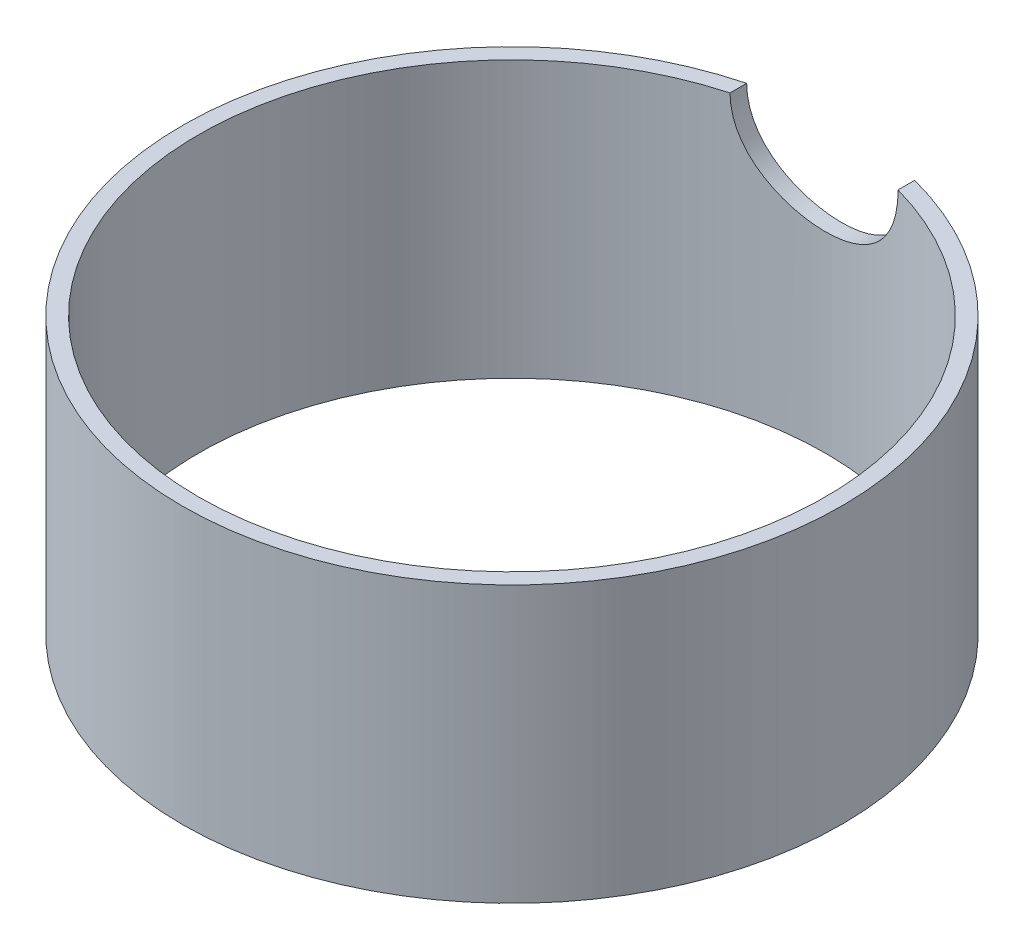
ISO-10303-21;
HEADER;
FILE_DESCRIPTION(('STEP AP214'),'2;1');
FILE_NAME('part.step','',(''),(''),'','','');
FILE_SCHEMA(('AUTOMOTIVE_DESIGN { 1 0 10303 214 1 1 1 1 }'));
ENDSEC;
DATA;
#1=APPLICATION_CONTEXT('core data for automotive mechanical design processes');
#2=APPLICATION_PROTOCOL_DEFINITION('international standard','automotive_design',2000,#1);
#3=PRODUCT_CONTEXT('',#1,'mechanical');
#4=PRODUCT('Part','Part','',(#3));
#5=PRODUCT_RELATED_PRODUCT_CATEGORY('part','',(#4));
#6=PRODUCT_DEFINITION_FORMATION('','',#4);
#7=PRODUCT_DEFINITION_CONTEXT('part definition',#1,'design');
#8=PRODUCT_DEFINITION('design','',#6,#7);
#9=PRODUCT_DEFINITION_SHAPE('','',#8);
#10=(LENGTH_UNIT() NAMED_UNIT(*) SI_UNIT(.MILLI.,.METRE.));
#11=(NAMED_UNIT(*) PLANE_ANGLE_UNIT() SI_UNIT($,.RADIAN.));
#12=(NAMED_UNIT(*) SI_UNIT($,.STERADIAN.) SOLID_ANGLE_UNIT());
#13=UNCERTAINTY_MEASURE_WITH_UNIT(LENGTH_MEASURE(1.E-05),#10,'distance_accuracy_value','');
#14=(GEOMETRIC_REPRESENTATION_CONTEXT(3) GLOBAL_UNCERTAINTY_ASSIGNED_CONTEXT((#13)) GLOBAL_UNIT_ASSIGNED_CONTEXT((#10,
#11,#12)) REPRESENTATION_CONTEXT('',''));
#15=CARTESIAN_POINT('',(0.,0.,0.));
#16=DIRECTION('',(0.,0.,1.));
#17=DIRECTION('',(1.,0.,0.));
#18=AXIS2_PLACEMENT_3D('',#15,#16,#17);
#19=CARTESIAN_POINT('',(0.,34.3,0.));
#20=DIRECTION('',(0.,1.,0.));
#21=DIRECTION('',(0.,0.,1.));
#22=AXIS2_PLACEMENT_3D('',#19,#20,#21);
#23=PLANE('',#22);
#24=DIRECTION('',(0.,0.,1.));
#25=VECTOR('',#24,1.);
#26=CARTESIAN_POINT('',(-10.45,34.3,-41.));
#27=LINE('',#26,#25);
#28=CARTESIAN_POINT('',(-10.45,34.3,-39.645901427512));
#29=VERTEX_POINT('',#28);
#30=CARTESIAN_POINT('',(-10.45,34.3,-37.5738938626275));
#31=VERTEX_POINT('',#30);
#32=EDGE_CURVE('E54',#29,#31,#27,.T.);
#33=ORIENTED_EDGE('',*,*,#32,.F.);
#34=CARTESIAN_POINT('',(0.,34.3,0.));
#35=DIRECTION('',(0.,1.,0.));
#36=DIRECTION('',(0.,0.,1.));
#37=AXIS2_PLACEMENT_3D('',#34,#35,#36);
#38=CIRCLE('',#37,41.);
#39=CARTESIAN_POINT('',(10.45,34.3,-39.645901427512));
#40=VERTEX_POINT('',#39);
#41=EDGE_CURVE('E48',#29,#40,#38,.T.);
#42=ORIENTED_EDGE('',*,*,#41,.T.);
#43=DIRECTION('',(0.,0.,1.));
#44=VECTOR('',#43,1.);
#45=CARTESIAN_POINT('',(10.45,34.3,-41.));
#46=LINE('',#45,#44);
#47=CARTESIAN_POINT('',(10.45,34.3,-37.5738938626275));
#48=VERTEX_POINT('',#47);
#49=EDGE_CURVE('E65',#48,#40,#46,.F.);
#50=ORIENTED_EDGE('',*,*,#49,.F.);
#51=CARTESIAN_POINT('',(0.,34.3,0.));
#52=DIRECTION('',(0.,1.,0.));
#53=DIRECTION('',(0.,0.,1.));
#54=AXIS2_PLACEMENT_3D('',#51,#52,#53);
#55=CIRCLE('',#54,39.);
#56=EDGE_CURVE('E71',#31,#48,#55,.T.);
#57=ORIENTED_EDGE('',*,*,#56,.F.);
#58=EDGE_LOOP('',(#33,#42,#50,#57));
#59=FACE_BOUND('',#58,.T.);
#60=ADVANCED_FACE('F33',(#59),#23,.T.);
#61=CARTESIAN_POINT('',(0.,0.,0.));
#62=DIRECTION('',(0.,1.,0.));
#63=DIRECTION('',(0.,0.,1.));
#64=AXIS2_PLACEMENT_3D('',#61,#62,#63);
#65=PLANE('',#64);
#66=CARTESIAN_POINT('',(0.,0.,0.));
#67=DIRECTION('',(0.,1.,0.));
#68=DIRECTION('',(0.,0.,1.));
#69=AXIS2_PLACEMENT_3D('',#66,#67,#68);
#70=CIRCLE('',#69,41.);
#71=CARTESIAN_POINT('',(0.,0.,41.));
#72=VERTEX_POINT('',#71);
#73=EDGE_CURVE('E76',#72,#72,#70,.T.);
#74=ORIENTED_EDGE('',*,*,#73,.F.);
#75=EDGE_LOOP('',(#74));
#76=FACE_BOUND('',#75,.T.);
#77=CARTESIAN_POINT('',(0.,0.,0.));
#78=DIRECTION('',(0.,1.,0.));
#79=DIRECTION('',(0.,0.,1.));
#80=AXIS2_PLACEMENT_3D('',#77,#78,#79);
#81=CIRCLE('',#80,39.);
#82=CARTESIAN_POINT('',(0.,0.,39.));
#83=VERTEX_POINT('',#82);
#84=EDGE_CURVE('E77',#83,#83,#81,.T.);
#85=ORIENTED_EDGE('',*,*,#84,.T.);
#86=EDGE_LOOP('',(#85));
#87=FACE_BOUND('',#86,.T.);
#88=ADVANCED_FACE('F96',(#76,#87),#65,.F.);
#89=CARTESIAN_POINT('',(0.,34.3,0.));
#90=DIRECTION('',(0.,-1.,0.));
#91=DIRECTION('',(0.,0.,-1.));
#92=AXIS2_PLACEMENT_3D('',#89,#90,#91);
#93=CYLINDRICAL_SURFACE('',#92,41.);
#94=ORIENTED_EDGE('',*,*,#41,.F.);
#95=CARTESIAN_POINT('',(-10.45,34.3,-39.645901427512));
#96=CARTESIAN_POINT('',(-10.4500368438836,34.0112052604951,-39.6458673603376));
#97=CARTESIAN_POINT('',(-10.4380300101083,33.7224224584076,-39.6490558010595));
#98=CARTESIAN_POINT('',(-10.3902001444511,33.1470202026528,-39.6616296629602));
#99=CARTESIAN_POINT('',(-10.3543812384641,32.8604003829073,-39.6710140105781));
#100=CARTESIAN_POINT('',(-10.2592945990659,32.2919382980589,-39.6957067801007));
#101=CARTESIAN_POINT('',(-10.2000745031508,32.0100875326951,-39.71100316557));
#102=CARTESIAN_POINT('',(-10.0586911320703,31.4525576093134,-39.7470512718942));
#103=CARTESIAN_POINT('',(-9.97652751652669,31.1768785429214,-39.7678030736826));
#104=CARTESIAN_POINT('',(-9.78994846095404,30.6336864705125,-39.8141448004812));
#105=CARTESIAN_POINT('',(-9.6855406114894,30.3661707143794,-39.8397330747708));
#106=CARTESIAN_POINT('',(-9.45521632135085,29.8408903456132,-39.8950236129089));
#107=CARTESIAN_POINT('',(-9.32929179059307,29.5831294454109,-39.9247274233655));
#108=CARTESIAN_POINT('',(-9.05690279276873,29.0791721920817,-39.987398369575));
#109=CARTESIAN_POINT('',(-8.91044154116916,28.8329740365979,-40.0203649942267));
#110=CARTESIAN_POINT('',(-8.59791187283406,28.3535444283777,-40.088670455776));
#111=CARTESIAN_POINT('',(-8.43183448330955,28.1203189819078,-40.1240103750495));
#112=CARTESIAN_POINT('',(-8.07763531389647,27.66377522658,-40.196830133563));
#113=CARTESIAN_POINT('',(-7.88913164319508,27.4407577393893,-40.234338979343));
#114=CARTESIAN_POINT('',(-7.49425670673086,27.0114027474804,-40.3097567874696));
#115=CARTESIAN_POINT('',(-7.28789316603187,26.8050581050729,-40.3476655706594));
#116=CARTESIAN_POINT('',(-6.8584514481281,26.4101788455125,-40.4228793953211));
#117=CARTESIAN_POINT('',(-6.63536381707103,26.2216544400603,-40.4601840805966));
#118=CARTESIAN_POINT('',(-6.174110381416,25.8638861146496,-40.5331327472467));
#119=CARTESIAN_POINT('',(-5.93595027730379,25.6946349724423,-40.5687773477242));
#120=CARTESIAN_POINT('',(-5.44240328793721,25.374161742658,-40.6379531803324));
#121=CARTESIAN_POINT('',(-5.18681396053993,25.2232427717348,-40.6714454351166));
#122=CARTESIAN_POINT('',(-4.66336344310647,24.9435262277956,-40.7347828592638));
#123=CARTESIAN_POINT('',(-4.39550209647532,24.814728937159,-40.7646279820703));
#124=CARTESIAN_POINT('',(-3.84942935533694,24.5802950055813,-40.8198135830379));
#125=CARTESIAN_POINT('',(-3.57121970225034,24.4746544882415,-40.8451548150069));
#126=CARTESIAN_POINT('',(-3.00641768536695,24.287384769855,-40.8906065529402));
#127=CARTESIAN_POINT('',(-2.71982552510236,24.2057549863449,-40.9107171857892));
#128=CARTESIAN_POINT('',(-2.14647395602522,24.068665848,-40.9447601292532));
#129=CARTESIAN_POINT('',(-1.85984450341102,24.0126928069987,-40.9588133406824));
#130=CARTESIAN_POINT('',(-1.28267980982847,23.9249128268876,-40.9809483195822));
#131=CARTESIAN_POINT('',(-0.992144618224668,23.8931055826386,-40.9890301624527));
#132=CARTESIAN_POINT('',(-0.409357337753075,23.8539379778427,-40.9989920863706));
#133=CARTESIAN_POINT('',(-0.117105443856222,23.8465748928941,-41.0008728585527));
#134=CARTESIAN_POINT('',(0.466959268206281,23.8563534868606,-40.9983808106222));
#135=CARTESIAN_POINT('',(0.758772092001782,23.8734948488473,-40.9940080713895));
#136=CARTESIAN_POINT('',(1.33306338718484,23.9314511823888,-40.9793062984528));
#137=CARTESIAN_POINT('',(1.61560176819125,23.9717101486429,-40.9691171880145));
#138=CARTESIAN_POINT('',(2.17618838022974,24.0751312748661,-40.9431671621998));
#139=CARTESIAN_POINT('',(2.45423669213014,24.1382930218634,-40.9274063472897));
#140=CARTESIAN_POINT('',(3.00393355596809,24.2870105109195,-40.8907357580868));
#141=CARTESIAN_POINT('',(3.27558195151647,24.3725667995967,-40.8698258581128));
#142=CARTESIAN_POINT('',(3.81064880176692,24.5654054893222,-40.8234133585548));
#143=CARTESIAN_POINT('',(4.07406713611667,24.6726882079154,-40.7979106918452));
#144=CARTESIAN_POINT('',(4.59330956807969,24.9092522749408,-40.7427330805346));
#145=CARTESIAN_POINT('',(4.84904243538839,25.0387254266181,-40.7130221876318));
#146=CARTESIAN_POINT('',(5.34880281689806,25.3180853724138,-40.6503845271063));
#147=CARTESIAN_POINT('',(5.59282624526163,25.4679792229951,-40.6174566489577));
#148=CARTESIAN_POINT('',(6.06752137923254,25.7870995238962,-40.5492624752319));
#149=CARTESIAN_POINT('',(6.29819367604059,25.9563251172001,-40.513996283346));
#150=CARTESIAN_POINT('',(6.74476459762285,26.3129908961554,-40.4420488243379));
#151=CARTESIAN_POINT('',(6.96066291731456,26.5004314577525,-40.4053675280182));
#152=CARTESIAN_POINT('',(7.38220696633467,26.8978532389637,-40.3305112330858));
#153=CARTESIAN_POINT('',(7.58739198178296,27.1083209914532,-40.2923232799351));
#154=CARTESIAN_POINT('',(7.97929785420182,27.545777547647,-40.2165468372802));
#155=CARTESIAN_POINT('',(8.16602433951857,27.7727612784481,-40.1789581679935));
#156=CARTESIAN_POINT('',(8.51989710492811,28.2419288101288,-40.10541157875));
#157=CARTESIAN_POINT('',(8.68703438068662,28.4841195230781,-40.0694544133447));
#158=CARTESIAN_POINT('',(9.00044097122405,28.9820035386886,-40.0002228413847));
#159=CARTESIAN_POINT('',(9.14671094345448,29.2376964155986,-39.9669483503232));
#160=CARTESIAN_POINT('',(9.4180919156905,29.7624026629019,-39.9038729525829));
#161=CARTESIAN_POINT('',(9.54307485926258,30.0314848780428,-39.8740933819395));
#162=CARTESIAN_POINT('',(9.76984382352378,30.5796996933297,-39.8191382753024));
#163=CARTESIAN_POINT('',(9.87163087619826,30.8588318457138,-39.793962534494));
#164=CARTESIAN_POINT('',(10.0510573661207,31.4248010555536,-39.749022657032));
#165=CARTESIAN_POINT('',(10.1287260750808,31.7116283105045,-39.7292519639487));
#166=CARTESIAN_POINT('',(10.2593799182673,32.2910753064094,-39.695713469014));
#167=CARTESIAN_POINT('',(10.3123765990126,32.583692270797,-39.681942859315));
#168=CARTESIAN_POINT('',(10.3851732873343,33.1137306686374,-39.6629465784739));
#169=CARTESIAN_POINT('',(10.4094899513117,33.3505009897932,-39.6565634554929));
#170=CARTESIAN_POINT('',(10.4418972787809,33.8248409848075,-39.6480369867694));
#171=CARTESIAN_POINT('',(10.4500140403579,34.0624087543712,-39.6458868217967));
#172=CARTESIAN_POINT('',(10.45,34.3,-39.645901427512));
#173=B_SPLINE_CURVE_WITH_KNOTS('',3,(#95,#96,#97,#98,#99,#100,#101,#102,#103,#104,#105,#106,
#107,#108,#109,#110,#111,#112,#113,#114,#115,#116,#117,#118,#119,#120,#121,#122,#123,#124,#125,
#126,#127,#128,#129,#130,#131,#132,#133,#134,#135,#136,#137,#138,#139,#140,#141,#142,#143,#144,
#145,#146,#147,#148,#149,#150,#151,#152,#153,#154,#155,#156,#157,#158,#159,#160,#161,#162,#163,
#164,#165,#166,#167,#168,#169,#170,#171,#172),.UNSPECIFIED.,.F.,.F.,(4,2,2,2,2,2,2,2,2,2,2,2,2,
2,2,2,2,2,2,2,2,2,2,2,2,2,2,2,2,2,2,2,2,2,2,2,2,2,4),(0.,0.866098913349945,1.73204779767159,
2.59624288810411,3.46045079997393,4.32436428277423,5.18860330713596,6.05270716700358,
6.91720782612631,7.7994179740568,8.68124842208141,9.5635811686911,10.4455821840423,
11.340606711544,12.2356426630338,13.1305286726455,14.0253929719091,14.9014609538454,
15.7775178735676,16.653477149878,17.5294250970688,18.3851387140813,19.2408369020506,
20.0965559783279,20.9522875623638,21.8158276420485,22.6796668823168,23.5434678416574,
24.407286633101,25.295461257298,26.1833642198615,27.0716737265295,27.959955239668,
28.853404868785,29.7468147405574,30.6391360308962,31.531039293664,32.2447706514485,
32.9573512550355),.UNSPECIFIED.);
#174=EDGE_CURVE('E59',#29,#40,#173,.T.);
#175=ORIENTED_EDGE('',*,*,#174,.T.);
#176=EDGE_LOOP('',(#94,#175));
#177=FACE_BOUND('',#176,.T.);
#178=ORIENTED_EDGE('',*,*,#73,.T.);
#179=EDGE_LOOP('',(#178));
#180=FACE_BOUND('',#179,.T.);
#181=ADVANCED_FACE('F35',(#177,#180),#93,.T.);
#182=CARTESIAN_POINT('',(0.,34.3,0.));
#183=DIRECTION('',(0.,-1.,0.));
#184=DIRECTION('',(0.,0.,-1.));
#185=AXIS2_PLACEMENT_3D('',#182,#183,#184);
#186=CYLINDRICAL_SURFACE('',#185,39.);
#187=CARTESIAN_POINT('',(-10.45,34.3,-37.5738938626275));
#188=CARTESIAN_POINT('',(-10.4500373920709,34.0117491083462,-37.5738577903348));
#189=CARTESIAN_POINT('',(-10.4380750900914,33.7235109736397,-37.5772096511429));
#190=CARTESIAN_POINT('',(-10.3904267658209,33.1492048806012,-37.5904264048467));
#191=CARTESIAN_POINT('',(-10.3547451827669,32.8631365263099,-37.6002900790066));
#192=CARTESIAN_POINT('',(-10.2600363187395,32.2958194785899,-37.6262397112694));
#193=CARTESIAN_POINT('',(-10.201059704351,32.014561698183,-37.6423121636508));
#194=CARTESIAN_POINT('',(-10.0602723818592,31.4582146776707,-37.6801839589875));
#195=CARTESIAN_POINT('',(-9.97846126571851,31.1831255478898,-37.70198340428));
#196=CARTESIAN_POINT('',(-9.79270803170171,30.641118802675,-37.7506564741922));
#197=CARTESIAN_POINT('',(-9.68877496871096,30.3741978948248,-37.7775280222069));
#198=CARTESIAN_POINT('',(-9.45952074738847,29.8500769913891,-37.8355844066197));
#199=CARTESIAN_POINT('',(-9.33419153799919,29.592880699697,-37.8667708658155));
#200=CARTESIAN_POINT('',(-9.06310545558156,29.0899895073372,-37.9325659606546));
#201=CARTESIAN_POINT('',(-8.91735082992566,28.8442933452927,-37.9671742196801));
#202=CARTESIAN_POINT('',(-8.60634446947611,28.3657943164186,-38.0388788488303));
#203=CARTESIAN_POINT('',(-8.44108380251954,28.1329974286554,-38.0759763554443));
#204=CARTESIAN_POINT('',(-8.08825192538371,27.6767288419915,-38.1525030749824));
#205=CARTESIAN_POINT('',(-7.90025993568542,27.4535880945947,-38.1919660792141));
#206=CARTESIAN_POINT('',(-7.50641503261476,27.0239345577609,-38.2713216243548));
#207=CARTESIAN_POINT('',(-7.30056979761296,26.8174146929281,-38.3112139742069));
#208=CARTESIAN_POINT('',(-6.87215594529444,26.4221216081399,-38.390375612173));
#209=CARTESIAN_POINT('',(-6.6495778480358,26.2333585866765,-38.4296445315929));
#210=CARTESIAN_POINT('',(-6.18931626576442,25.8750436148559,-38.5064510149797));
#211=CARTESIAN_POINT('',(-5.95163849108334,25.7054844687731,-38.5439892242997));
#212=CARTESIAN_POINT('',(-5.45861259014551,25.3840559977579,-38.6169217750298));
#213=CARTESIAN_POINT('',(-5.20303841137456,25.2325228253616,-38.6522707976042));
#214=CARTESIAN_POINT('',(-4.6795159575024,24.9515840617272,-38.7191394205522));
#215=CARTESIAN_POINT('',(-4.41156750690842,24.8221787844309,-38.7506589665928));
#216=CARTESIAN_POINT('',(-3.86521809590414,24.5865518440306,-38.808962101489));
#217=CARTESIAN_POINT('',(-3.58681901320604,24.480326039313,-38.8357465362324));
#218=CARTESIAN_POINT('',(-3.02153667696182,24.2919248430342,-38.883811073634));
#219=CARTESIAN_POINT('',(-2.73465365221985,24.2097488035229,-38.9050913245845));
#220=CARTESIAN_POINT('',(-2.16124596868058,24.0717814141104,-38.941104548425));
#221=CARTESIAN_POINT('',(-1.87486615676168,24.0154243551832,-38.9559774259799));
#222=CARTESIAN_POINT('',(-1.29814345111737,23.9268407731413,-38.9794574546225));
#223=CARTESIAN_POINT('',(-1.00780061256514,23.8946139144347,-38.9880646928498));
#224=CARTESIAN_POINT('',(-0.42535278042266,23.8545810326776,-38.9987679865144));
#225=CARTESIAN_POINT('',(-0.13324801164921,23.8467719573824,-39.0008648557534));
#226=CARTESIAN_POINT('',(0.450560700083238,23.8556369695334,-38.998489709896));
#227=CARTESIAN_POINT('',(0.742264648747825,23.8723107047812,-38.9940177892952));
#228=CARTESIAN_POINT('',(1.31566789482434,23.929252605249,-38.9788298426001));
#229=CARTESIAN_POINT('',(1.59743259409284,23.9689080885779,-38.9682759972049));
#230=CARTESIAN_POINT('',(2.15651625867977,24.0709881176464,-38.9413374533237));
#231=CARTESIAN_POINT('',(2.43383531249339,24.1334122095643,-38.9249528710555));
#232=CARTESIAN_POINT('',(2.98212785740404,24.2805197497266,-38.8867900921682));
#233=CARTESIAN_POINT('',(3.25310118877776,24.365203757604,-38.8650117599465));
#234=CARTESIAN_POINT('',(3.7868852975127,24.556163406933,-38.8166372330642));
#235=CARTESIAN_POINT('',(4.04969594535906,24.6624393907765,-38.7900409620044));
#236=CARTESIAN_POINT('',(4.56798278338125,24.8969298139873,-38.7324436470119));
#237=CARTESIAN_POINT('',(4.82336153066071,25.0253495597617,-38.701401889635));
#238=CARTESIAN_POINT('',(5.32250249464289,25.3025010540259,-38.6359205568874));
#239=CARTESIAN_POINT('',(5.56626065995522,25.4512398176634,-38.6014798091589));
#240=CARTESIAN_POINT('',(6.04053849063783,25.7679600431493,-38.5301104349061));
#241=CARTESIAN_POINT('',(6.27105853042812,25.9359409603602,-38.4931818788099));
#242=CARTESIAN_POINT('',(6.71745548670717,26.2900398743007,-38.4177959048086));
#243=CARTESIAN_POINT('',(6.93333206692628,26.4761582872973,-38.3793384518264));
#244=CARTESIAN_POINT('',(7.35558499466213,26.8714016685751,-38.3006908440009));
#245=CARTESIAN_POINT('',(7.56145753374542,27.0810619022887,-38.2604839857264));
#246=CARTESIAN_POINT('',(7.95481086713835,27.5169591333522,-38.1806398607475));
#247=CARTESIAN_POINT('',(8.14229722347865,27.7431910811654,-38.1410024249026));
#248=CARTESIAN_POINT('',(8.4977668149349,28.2109293996089,-38.0633824155202));
#249=CARTESIAN_POINT('',(8.66574103542036,28.4524427513003,-38.0254006119094));
#250=CARTESIAN_POINT('',(8.98089619917667,28.9490665329513,-37.9522026295156));
#251=CARTESIAN_POINT('',(9.12807778870538,29.2041765399722,-37.9169863647916));
#252=CARTESIAN_POINT('',(9.40150003054529,29.7281065679616,-37.8501222440888));
#253=CARTESIAN_POINT('',(9.52758948951677,29.9970089062559,-37.8185006326935));
#254=CARTESIAN_POINT('',(9.75657435446191,30.5450121387436,-37.7600745381941));
#255=CARTESIAN_POINT('',(9.85947084864728,30.8241125537299,-37.7332698290934));
#256=CARTESIAN_POINT('',(10.0410966710383,31.3901680252034,-37.6853446660831));
#257=CARTESIAN_POINT('',(10.11985535131,31.6771130760217,-37.66421731228));
#258=CARTESIAN_POINT('',(10.2526483430768,32.256936511639,-37.6282862538017));
#259=CARTESIAN_POINT('',(10.3066941730884,32.5498120656549,-37.6134796032975));
#260=CARTESIAN_POINT('',(10.3820563744742,33.0856406262467,-37.5927411611194));
#261=CARTESIAN_POINT('',(10.407540555675,33.3279728410177,-37.5856842636542));
#262=CARTESIAN_POINT('',(10.4415070574466,33.8135301584575,-37.5762556688693));
#263=CARTESIAN_POINT('',(10.4500162129729,34.0567532419112,-37.5738765767309));
#264=CARTESIAN_POINT('',(10.45,34.3,-37.5738938626275));
#265=B_SPLINE_CURVE_WITH_KNOTS('',3,(#187,#188,#189,#190,#191,#192,#193,#194,#195,#196,#197,
#198,#199,#200,#201,#202,#203,#204,#205,#206,#207,#208,#209,#210,#211,#212,#213,#214,#215,#216,
#217,#218,#219,#220,#221,#222,#223,#224,#225,#226,#227,#228,#229,#230,#231,#232,#233,#234,#235,
#236,#237,#238,#239,#240,#241,#242,#243,#244,#245,#246,#247,#248,#249,#250,#251,#252,#253,#254,
#255,#256,#257,#258,#259,#260,#261,#262,#263,#264),.UNSPECIFIED.,.F.,.F.,(4,2,2,2,2,2,2,2,2,2,2,
2,2,2,2,2,2,2,2,2,2,2,2,2,2,2,2,2,2,2,2,2,2,2,2,2,2,2,4),(0.,0.86446555364706,1.7287693617797,
2.59120357406108,3.453653198453,4.31575048423306,5.17817288253661,6.0405004644232,
6.90322446468157,7.78550244376317,8.66740283439857,9.54980668343005,10.4318787926017,
11.3284333784159,12.2250006831362,13.1214076614545,14.0177904865056,14.8934639851426,
15.7691253050808,16.6446771621952,17.5202164241502,18.3734229223376,19.2266124154238,
20.0798233604584,20.9330478362271,21.7946561007941,22.6565625912542,23.5184446919971,
24.3803465781431,25.2690368140743,26.1574573763286,27.0462867710988,27.935088533992,
28.8300111715943,29.7248918107668,30.6186798995133,31.5120509730948,32.2427420988202,
32.9722771938146),.UNSPECIFIED.);
#266=EDGE_CURVE('E11',#31,#48,#265,.T.);
#267=ORIENTED_EDGE('',*,*,#266,.F.);
#268=ORIENTED_EDGE('',*,*,#56,.T.);
#269=EDGE_LOOP('',(#267,#268));
#270=FACE_BOUND('',#269,.T.);
#271=ORIENTED_EDGE('',*,*,#84,.F.);
#272=EDGE_LOOP('',(#271));
#273=FACE_BOUND('',#272,.T.);
#274=ADVANCED_FACE('F74',(#270,#273),#186,.F.);
#275=CARTESIAN_POINT('',(0.,34.3,-41.));
#276=DIRECTION('',(0.,0.,1.));
#277=DIRECTION('',(1.,0.,0.));
#278=AXIS2_PLACEMENT_3D('',#275,#276,#277);
#279=CYLINDRICAL_SURFACE('',#278,10.45);
#280=ORIENTED_EDGE('',*,*,#32,.T.);
#281=ORIENTED_EDGE('',*,*,#266,.T.);
#282=ORIENTED_EDGE('',*,*,#49,.T.);
#283=ORIENTED_EDGE('',*,*,#174,.F.);
#284=EDGE_LOOP('',(#280,#281,#282,#283));
#285=FACE_BOUND('',#284,.T.);
#286=ADVANCED_FACE('F64',(#285),#279,.F.);
#287=CLOSED_SHELL('',(#60,#88,#181,#274,#286));
#288=MANIFOLD_SOLID_BREP('B2',#287);
#289=ADVANCED_BREP_SHAPE_REPRESENTATION('',(#18,#288),#14);
#290=SHAPE_DEFINITION_REPRESENTATION(#9,#289);
ENDSEC;
END-ISO-10303-21;
